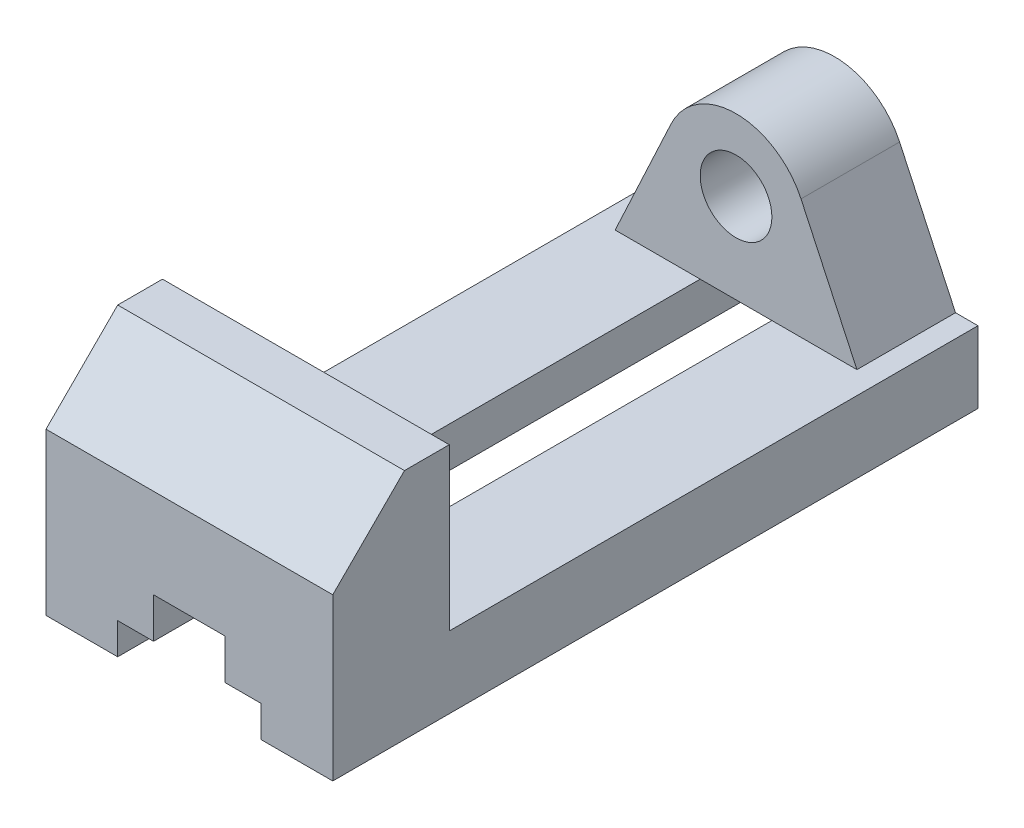
ISO-10303-21;
HEADER;
FILE_DESCRIPTION(('STEP AP214'),'2;1');
FILE_NAME('part.step','',(''),(''),'','','');
FILE_SCHEMA(('AUTOMOTIVE_DESIGN { 1 0 10303 214 1 1 1 1 }'));
ENDSEC;
DATA;
#1=APPLICATION_CONTEXT('core data for automotive mechanical design processes');
#2=APPLICATION_PROTOCOL_DEFINITION('international standard','automotive_design',2000,#1);
#3=PRODUCT_CONTEXT('',#1,'mechanical');
#4=PRODUCT('Part','Part','',(#3));
#5=PRODUCT_RELATED_PRODUCT_CATEGORY('part','',(#4));
#6=PRODUCT_DEFINITION_FORMATION('','',#4);
#7=PRODUCT_DEFINITION_CONTEXT('part definition',#1,'design');
#8=PRODUCT_DEFINITION('design','',#6,#7);
#9=PRODUCT_DEFINITION_SHAPE('','',#8);
#10=(LENGTH_UNIT() NAMED_UNIT(*) SI_UNIT(.MILLI.,.METRE.));
#11=(NAMED_UNIT(*) PLANE_ANGLE_UNIT() SI_UNIT($,.RADIAN.));
#12=(NAMED_UNIT(*) SI_UNIT($,.STERADIAN.) SOLID_ANGLE_UNIT());
#13=UNCERTAINTY_MEASURE_WITH_UNIT(LENGTH_MEASURE(1.E-05),#10,'distance_accuracy_value','');
#14=(GEOMETRIC_REPRESENTATION_CONTEXT(3) GLOBAL_UNCERTAINTY_ASSIGNED_CONTEXT((#13)) GLOBAL_UNIT_ASSIGNED_CONTEXT((#10,
#11,#12)) REPRESENTATION_CONTEXT('',''));
#15=CARTESIAN_POINT('',(0.,0.,0.));
#16=DIRECTION('',(0.,0.,1.));
#17=DIRECTION('',(1.,0.,0.));
#18=AXIS2_PLACEMENT_3D('',#15,#16,#17);
#19=CARTESIAN_POINT('',(0.,-10.,144.));
#20=DIRECTION('',(0.,1.,0.));
#21=DIRECTION('',(-1.,0.,0.));
#22=AXIS2_PLACEMENT_3D('',#19,#20,#21);
#23=PLANE('',#22);
#24=DIRECTION('',(1.,0.,0.));
#25=VECTOR('',#24,1.);
#26=CARTESIAN_POINT('',(0.,-10.,22.));
#27=LINE('',#26,#25);
#28=CARTESIAN_POINT('',(-26.9801998664999,-10.,22.));
#29=VERTEX_POINT('',#28);
#30=CARTESIAN_POINT('',(-8.00000000000001,-10.,22.));
#31=VERTEX_POINT('',#30);
#32=EDGE_CURVE('E257',#29,#31,#27,.T.);
#33=ORIENTED_EDGE('',*,*,#32,.F.);
#34=DIRECTION('',(0.,0.,-1.));
#35=VECTOR('',#34,1.);
#36=CARTESIAN_POINT('',(-26.9801998664999,-10.,22.));
#37=LINE('',#36,#35);
#38=CARTESIAN_POINT('',(-26.9801998664999,-10.,0.));
#39=VERTEX_POINT('',#38);
#40=EDGE_CURVE('E288',#29,#39,#37,.T.);
#41=ORIENTED_EDGE('',*,*,#40,.T.);
#42=DIRECTION('',(1.,0.,0.));
#43=VECTOR('',#42,1.);
#44=CARTESIAN_POINT('',(0.,-10.,0.));
#45=LINE('',#44,#43);
#46=CARTESIAN_POINT('',(-32.,-10.,0.));
#47=VERTEX_POINT('',#46);
#48=EDGE_CURVE('E312',#47,#39,#45,.T.);
#49=ORIENTED_EDGE('',*,*,#48,.F.);
#50=DIRECTION('',(0.,0.,-1.));
#51=VECTOR('',#50,1.);
#52=CARTESIAN_POINT('',(-32.,-10.,144.));
#53=LINE('',#52,#51);
#54=CARTESIAN_POINT('',(-32.,-10.,118.));
#55=VERTEX_POINT('',#54);
#56=EDGE_CURVE('E328',#55,#47,#53,.T.);
#57=ORIENTED_EDGE('',*,*,#56,.F.);
#58=DIRECTION('',(-1.,0.,0.));
#59=VECTOR('',#58,1.);
#60=CARTESIAN_POINT('',(0.,-10.,118.));
#61=LINE('',#60,#59);
#62=CARTESIAN_POINT('',(-8.00000000000001,-10.,118.));
#63=VERTEX_POINT('',#62);
#64=EDGE_CURVE('E456',#63,#55,#61,.T.);
#65=ORIENTED_EDGE('',*,*,#64,.F.);
#66=DIRECTION('',(0.,0.,-1.));
#67=VECTOR('',#66,1.);
#68=CARTESIAN_POINT('',(-8.00000000000001,-10.,144.));
#69=LINE('',#68,#67);
#70=EDGE_CURVE('E331',#63,#31,#69,.T.);
#71=ORIENTED_EDGE('',*,*,#70,.T.);
#72=EDGE_LOOP('',(#33,#41,#49,#57,#65,#71));
#73=FACE_BOUND('',#72,.T.);
#74=ADVANCED_FACE('F47',(#73),#23,.T.);
#75=CARTESIAN_POINT('',(0.,-10.,144.));
#76=DIRECTION('',(0.,1.,0.));
#77=DIRECTION('',(-1.,0.,0.));
#78=AXIS2_PLACEMENT_3D('',#75,#76,#77);
#79=PLANE('',#78);
#80=DIRECTION('',(0.,0.,-1.));
#81=VECTOR('',#80,1.);
#82=CARTESIAN_POINT('',(26.9801998664999,-10.,22.));
#83=LINE('',#82,#81);
#84=CARTESIAN_POINT('',(26.9801998664999,-10.,22.));
#85=VERTEX_POINT('',#84);
#86=CARTESIAN_POINT('',(26.9801998664999,-10.,0.));
#87=VERTEX_POINT('',#86);
#88=EDGE_CURVE('E284',#85,#87,#83,.T.);
#89=ORIENTED_EDGE('',*,*,#88,.F.);
#90=CARTESIAN_POINT('',(7.99999999999999,-10.,22.));
#91=VERTEX_POINT('',#90);
#92=EDGE_CURVE('E256',#91,#85,#27,.T.);
#93=ORIENTED_EDGE('',*,*,#92,.F.);
#94=DIRECTION('',(0.,0.,-1.));
#95=VECTOR('',#94,1.);
#96=CARTESIAN_POINT('',(7.99999999999999,-10.,144.));
#97=LINE('',#96,#95);
#98=CARTESIAN_POINT('',(7.99999999999999,-10.,118.));
#99=VERTEX_POINT('',#98);
#100=EDGE_CURVE('E410',#99,#91,#97,.T.);
#101=ORIENTED_EDGE('',*,*,#100,.F.);
#102=DIRECTION('',(1.,0.,0.));
#103=VECTOR('',#102,1.);
#104=CARTESIAN_POINT('',(0.,-10.,118.));
#105=LINE('',#104,#103);
#106=CARTESIAN_POINT('',(32.,-10.,118.));
#107=VERTEX_POINT('',#106);
#108=EDGE_CURVE('E452',#99,#107,#105,.T.);
#109=ORIENTED_EDGE('',*,*,#108,.T.);
#110=DIRECTION('',(0.,0.,-1.));
#111=VECTOR('',#110,1.);
#112=CARTESIAN_POINT('',(32.,-10.,144.));
#113=LINE('',#112,#111);
#114=CARTESIAN_POINT('',(32.,-10.,0.));
#115=VERTEX_POINT('',#114);
#116=EDGE_CURVE('E436',#107,#115,#113,.T.);
#117=ORIENTED_EDGE('',*,*,#116,.T.);
#118=DIRECTION('',(1.,0.,0.));
#119=VECTOR('',#118,1.);
#120=CARTESIAN_POINT('',(0.,-10.,0.));
#121=LINE('',#120,#119);
#122=EDGE_CURVE('E397',#87,#115,#121,.T.);
#123=ORIENTED_EDGE('',*,*,#122,.F.);
#124=EDGE_LOOP('',(#89,#93,#101,#109,#117,#123));
#125=FACE_BOUND('',#124,.T.);
#126=ADVANCED_FACE('F483',(#125),#79,.T.);
#127=CARTESIAN_POINT('',(7.99999999999999,0.,144.));
#128=DIRECTION('',(-1.,0.,0.));
#129=DIRECTION('',(0.,-1.,0.));
#130=AXIS2_PLACEMENT_3D('',#127,#128,#129);
#131=PLANE('',#130);
#132=CARTESIAN_POINT('',(7.99999999999999,-10.,144.));
#133=VERTEX_POINT('',#132);
#134=EDGE_CURVE('E432',#133,#99,#97,.T.);
#135=ORIENTED_EDGE('',*,*,#134,.T.);
#136=ORIENTED_EDGE('',*,*,#100,.T.);
#137=DIRECTION('',(0.,0.,-1.));
#138=VECTOR('',#137,1.);
#139=CARTESIAN_POINT('',(7.99999999999999,-10.,144.));
#140=LINE('',#139,#138);
#141=CARTESIAN_POINT('',(7.99999999999999,-10.,0.));
#142=VERTEX_POINT('',#141);
#143=EDGE_CURVE('E300',#91,#142,#140,.T.);
#144=ORIENTED_EDGE('',*,*,#143,.T.);
#145=DIRECTION('',(0.,1.,0.));
#146=VECTOR('',#145,1.);
#147=CARTESIAN_POINT('',(7.99999999999999,0.,0.));
#148=LINE('',#147,#146);
#149=CARTESIAN_POINT('',(7.99999999999999,-19.,0.));
#150=VERTEX_POINT('',#149);
#151=EDGE_CURVE('E391',#150,#142,#148,.T.);
#152=ORIENTED_EDGE('',*,*,#151,.F.);
#153=DIRECTION('',(0.,0.,-1.));
#154=VECTOR('',#153,1.);
#155=CARTESIAN_POINT('',(7.99999999999999,-19.,144.));
#156=LINE('',#155,#154);
#157=CARTESIAN_POINT('',(7.99999999999999,-19.,144.));
#158=VERTEX_POINT('',#157);
#159=EDGE_CURVE('E449',#158,#150,#156,.T.);
#160=ORIENTED_EDGE('',*,*,#159,.F.);
#161=DIRECTION('',(0.,1.,0.));
#162=VECTOR('',#161,1.);
#163=CARTESIAN_POINT('',(7.99999999999999,0.,144.));
#164=LINE('',#163,#162);
#165=EDGE_CURVE('E392',#158,#133,#164,.T.);
#166=ORIENTED_EDGE('',*,*,#165,.T.);
#167=EDGE_LOOP('',(#135,#136,#144,#152,#160,#166));
#168=FACE_BOUND('',#167,.T.);
#169=ADVANCED_FACE('F530',(#168),#131,.T.);
#170=CARTESIAN_POINT('',(0.,-19.,144.));
#171=DIRECTION('',(0.,1.,0.));
#172=DIRECTION('',(0.,0.,1.));
#173=AXIS2_PLACEMENT_3D('',#170,#171,#172);
#174=PLANE('',#173);
#175=ORIENTED_EDGE('',*,*,#159,.T.);
#176=DIRECTION('',(1.,0.,0.));
#177=VECTOR('',#176,1.);
#178=CARTESIAN_POINT('',(0.,-19.,0.));
#179=LINE('',#178,#177);
#180=CARTESIAN_POINT('',(16.,-19.,0.));
#181=VERTEX_POINT('',#180);
#182=EDGE_CURVE('E414',#150,#181,#179,.T.);
#183=ORIENTED_EDGE('',*,*,#182,.T.);
#184=DIRECTION('',(0.,0.,-1.));
#185=VECTOR('',#184,1.);
#186=CARTESIAN_POINT('',(16.,-19.,144.));
#187=LINE('',#186,#185);
#188=CARTESIAN_POINT('',(16.,-19.,144.));
#189=VERTEX_POINT('',#188);
#190=EDGE_CURVE('E446',#189,#181,#187,.T.);
#191=ORIENTED_EDGE('',*,*,#190,.F.);
#192=DIRECTION('',(1.,0.,0.));
#193=VECTOR('',#192,1.);
#194=CARTESIAN_POINT('',(0.,-19.,144.));
#195=LINE('',#194,#193);
#196=EDGE_CURVE('E396',#158,#189,#195,.T.);
#197=ORIENTED_EDGE('',*,*,#196,.F.);
#198=EDGE_LOOP('',(#175,#183,#191,#197));
#199=FACE_BOUND('',#198,.T.);
#200=ADVANCED_FACE('F527',(#199),#174,.F.);
#201=CARTESIAN_POINT('',(16.,0.,144.));
#202=DIRECTION('',(-1.,0.,0.));
#203=DIRECTION('',(0.,-1.,0.));
#204=AXIS2_PLACEMENT_3D('',#201,#202,#203);
#205=PLANE('',#204);
#206=ORIENTED_EDGE('',*,*,#190,.T.);
#207=DIRECTION('',(0.,1.,0.));
#208=VECTOR('',#207,1.);
#209=CARTESIAN_POINT('',(16.,0.,0.));
#210=LINE('',#209,#208);
#211=CARTESIAN_POINT('',(16.,-26.,0.));
#212=VERTEX_POINT('',#211);
#213=EDGE_CURVE('E418',#212,#181,#210,.T.);
#214=ORIENTED_EDGE('',*,*,#213,.F.);
#215=DIRECTION('',(0.,0.,-1.));
#216=VECTOR('',#215,1.);
#217=CARTESIAN_POINT('',(16.,-26.,144.));
#218=LINE('',#217,#216);
#219=CARTESIAN_POINT('',(16.,-26.,144.));
#220=VERTEX_POINT('',#219);
#221=EDGE_CURVE('E443',#220,#212,#218,.T.);
#222=ORIENTED_EDGE('',*,*,#221,.F.);
#223=DIRECTION('',(0.,1.,0.));
#224=VECTOR('',#223,1.);
#225=CARTESIAN_POINT('',(16.,0.,144.));
#226=LINE('',#225,#224);
#227=EDGE_CURVE('E400',#220,#189,#226,.T.);
#228=ORIENTED_EDGE('',*,*,#227,.T.);
#229=EDGE_LOOP('',(#206,#214,#222,#228));
#230=FACE_BOUND('',#229,.T.);
#231=ADVANCED_FACE('F522',(#230),#205,.T.);
#232=CARTESIAN_POINT('',(0.,-26.,144.));
#233=DIRECTION('',(0.,1.,0.));
#234=DIRECTION('',(-1.,0.,0.));
#235=AXIS2_PLACEMENT_3D('',#232,#233,#234);
#236=PLANE('',#235);
#237=CARTESIAN_POINT('',(22.,-26.,38.));
#238=DIRECTION('',(0.,-1.,0.));
#239=DIRECTION('',(0.,0.,-1.));
#240=AXIS2_PLACEMENT_3D('',#237,#238,#239);
#241=CIRCLE('',#240,2.99999999999999);
#242=CARTESIAN_POINT('',(22.,-26.,35.));
#243=VERTEX_POINT('',#242);
#244=EDGE_CURVE('E214',#243,#243,#241,.T.);
#245=ORIENTED_EDGE('',*,*,#244,.F.);
#246=EDGE_LOOP('',(#245));
#247=FACE_BOUND('',#246,.T.);
#248=CARTESIAN_POINT('',(22.,-26.,108.));
#249=DIRECTION('',(0.,-1.,0.));
#250=DIRECTION('',(0.,0.,-1.));
#251=AXIS2_PLACEMENT_3D('',#248,#249,#250);
#252=CIRCLE('',#251,2.99999999999999);
#253=CARTESIAN_POINT('',(22.,-26.,105.));
#254=VERTEX_POINT('',#253);
#255=EDGE_CURVE('E227',#254,#254,#252,.T.);
#256=ORIENTED_EDGE('',*,*,#255,.F.);
#257=EDGE_LOOP('',(#256));
#258=FACE_BOUND('',#257,.T.);
#259=ORIENTED_EDGE('',*,*,#221,.T.);
#260=DIRECTION('',(1.,0.,0.));
#261=VECTOR('',#260,1.);
#262=CARTESIAN_POINT('',(0.,-26.,0.));
#263=LINE('',#262,#261);
#264=CARTESIAN_POINT('',(32.,-26.,0.));
#265=VERTEX_POINT('',#264);
#266=EDGE_CURVE('E422',#212,#265,#263,.T.);
#267=ORIENTED_EDGE('',*,*,#266,.T.);
#268=DIRECTION('',(0.,0.,-1.));
#269=VECTOR('',#268,1.);
#270=CARTESIAN_POINT('',(32.,-26.,144.));
#271=LINE('',#270,#269);
#272=CARTESIAN_POINT('',(32.,-26.,144.));
#273=VERTEX_POINT('',#272);
#274=EDGE_CURVE('E440',#273,#265,#271,.T.);
#275=ORIENTED_EDGE('',*,*,#274,.F.);
#276=DIRECTION('',(1.,0.,0.));
#277=VECTOR('',#276,1.);
#278=CARTESIAN_POINT('',(0.,-26.,144.));
#279=LINE('',#278,#277);
#280=EDGE_CURVE('E404',#220,#273,#279,.T.);
#281=ORIENTED_EDGE('',*,*,#280,.F.);
#282=EDGE_LOOP('',(#259,#267,#275,#281));
#283=FACE_BOUND('',#282,.T.);
#284=ADVANCED_FACE('F518',(#247,#258,#283),#236,.F.);
#285=CARTESIAN_POINT('',(32.,0.,144.));
#286=DIRECTION('',(-1.,0.,0.));
#287=DIRECTION('',(0.,-1.,0.));
#288=AXIS2_PLACEMENT_3D('',#285,#286,#287);
#289=PLANE('',#288);
#290=DIRECTION('',(0.,0.,-1.));
#291=VECTOR('',#290,1.);
#292=CARTESIAN_POINT('',(32.,26.,144.));
#293=LINE('',#292,#291);
#294=CARTESIAN_POINT('',(32.,26.,128.));
#295=VERTEX_POINT('',#294);
#296=CARTESIAN_POINT('',(32.,26.,118.));
#297=VERTEX_POINT('',#296);
#298=EDGE_CURVE('E355',#295,#297,#293,.T.);
#299=ORIENTED_EDGE('',*,*,#298,.F.);
#300=DIRECTION('',(0.,0.707106781186548,-0.707106781186547));
#301=VECTOR('',#300,1.);
#302=CARTESIAN_POINT('',(32.,26.,128.));
#303=LINE('',#302,#301);
#304=CARTESIAN_POINT('',(32.,10.,144.));
#305=VERTEX_POINT('',#304);
#306=EDGE_CURVE('E71',#295,#305,#303,.F.);
#307=ORIENTED_EDGE('',*,*,#306,.T.);
#308=DIRECTION('',(0.,1.,0.));
#309=VECTOR('',#308,1.);
#310=CARTESIAN_POINT('',(32.,0.,144.));
#311=LINE('',#310,#309);
#312=EDGE_CURVE('E407',#273,#305,#311,.T.);
#313=ORIENTED_EDGE('',*,*,#312,.F.);
#314=ORIENTED_EDGE('',*,*,#274,.T.);
#315=DIRECTION('',(0.,1.,0.));
#316=VECTOR('',#315,1.);
#317=CARTESIAN_POINT('',(32.,0.,0.));
#318=LINE('',#317,#316);
#319=EDGE_CURVE('E426',#265,#115,#318,.T.);
#320=ORIENTED_EDGE('',*,*,#319,.T.);
#321=ORIENTED_EDGE('',*,*,#116,.F.);
#322=DIRECTION('',(0.,1.,0.));
#323=VECTOR('',#322,1.);
#324=CARTESIAN_POINT('',(32.,0.,118.));
#325=LINE('',#324,#323);
#326=EDGE_CURVE('E340',#107,#297,#325,.T.);
#327=ORIENTED_EDGE('',*,*,#326,.T.);
#328=EDGE_LOOP('',(#299,#307,#313,#314,#320,#321,#327));
#329=FACE_BOUND('',#328,.T.);
#330=ADVANCED_FACE('F514',(#329),#289,.F.);
#331=CARTESIAN_POINT('',(0.,0.,144.));
#332=DIRECTION('',(0.,0.,1.));
#333=DIRECTION('',(1.,0.,0.));
#334=AXIS2_PLACEMENT_3D('',#331,#332,#333);
#335=PLANE('',#334);
#336=ORIENTED_EDGE('',*,*,#312,.T.);
#337=DIRECTION('',(-1.,0.,0.));
#338=VECTOR('',#337,1.);
#339=CARTESIAN_POINT('',(0.,10.,144.));
#340=LINE('',#339,#338);
#341=CARTESIAN_POINT('',(-32.,10.,144.));
#342=VERTEX_POINT('',#341);
#343=EDGE_CURVE('E57',#305,#342,#340,.T.);
#344=ORIENTED_EDGE('',*,*,#343,.T.);
#345=DIRECTION('',(0.,1.,0.));
#346=VECTOR('',#345,1.);
#347=CARTESIAN_POINT('',(-32.,0.,144.));
#348=LINE('',#347,#346);
#349=CARTESIAN_POINT('',(-32.,-26.,144.));
#350=VERTEX_POINT('',#349);
#351=EDGE_CURVE('E336',#350,#342,#348,.T.);
#352=ORIENTED_EDGE('',*,*,#351,.F.);
#353=DIRECTION('',(1.,0.,0.));
#354=VECTOR('',#353,1.);
#355=CARTESIAN_POINT('',(0.,-26.,144.));
#356=LINE('',#355,#354);
#357=CARTESIAN_POINT('',(-16.,-26.,144.));
#358=VERTEX_POINT('',#357);
#359=EDGE_CURVE('E339',#350,#358,#356,.T.);
#360=ORIENTED_EDGE('',*,*,#359,.T.);
#361=DIRECTION('',(0.,1.,0.));
#362=VECTOR('',#361,1.);
#363=CARTESIAN_POINT('',(-16.,0.,144.));
#364=LINE('',#363,#362);
#365=CARTESIAN_POINT('',(-16.,-19.,144.));
#366=VERTEX_POINT('',#365);
#367=EDGE_CURVE('E343',#358,#366,#364,.T.);
#368=ORIENTED_EDGE('',*,*,#367,.T.);
#369=DIRECTION('',(1.,0.,0.));
#370=VECTOR('',#369,1.);
#371=CARTESIAN_POINT('',(0.,-19.,144.));
#372=LINE('',#371,#370);
#373=CARTESIAN_POINT('',(-8.00000000000001,-19.,144.));
#374=VERTEX_POINT('',#373);
#375=EDGE_CURVE('E346',#366,#374,#372,.T.);
#376=ORIENTED_EDGE('',*,*,#375,.T.);
#377=DIRECTION('',(0.,1.,0.));
#378=VECTOR('',#377,1.);
#379=CARTESIAN_POINT('',(-8.00000000000001,0.,144.));
#380=LINE('',#379,#378);
#381=CARTESIAN_POINT('',(-8.00000000000001,-10.,144.));
#382=VERTEX_POINT('',#381);
#383=EDGE_CURVE('E349',#374,#382,#380,.T.);
#384=ORIENTED_EDGE('',*,*,#383,.T.);
#385=DIRECTION('',(1.,0.,0.));
#386=VECTOR('',#385,1.);
#387=CARTESIAN_POINT('',(0.,-10.,144.));
#388=LINE('',#387,#386);
#389=EDGE_CURVE('E352',#382,#133,#388,.T.);
#390=ORIENTED_EDGE('',*,*,#389,.T.);
#391=ORIENTED_EDGE('',*,*,#165,.F.);
#392=ORIENTED_EDGE('',*,*,#196,.T.);
#393=ORIENTED_EDGE('',*,*,#227,.F.);
#394=ORIENTED_EDGE('',*,*,#280,.T.);
#395=EDGE_LOOP('',(#336,#344,#352,#360,#368,#376,#384,#390,#391,#392,#393,#394));
#396=FACE_BOUND('',#395,.T.);
#397=ADVANCED_FACE('F558',(#396),#335,.T.);
#398=CARTESIAN_POINT('',(0.,0.,0.));
#399=DIRECTION('',(0.,0.,1.));
#400=DIRECTION('',(1.,0.,0.));
#401=AXIS2_PLACEMENT_3D('',#398,#399,#400);
#402=PLANE('',#401);
#403=ORIENTED_EDGE('',*,*,#151,.T.);
#404=DIRECTION('',(1.,0.,0.));
#405=VECTOR('',#404,1.);
#406=CARTESIAN_POINT('',(0.,-10.,0.));
#407=LINE('',#406,#405);
#408=CARTESIAN_POINT('',(-8.00000000000001,-10.,0.));
#409=VERTEX_POINT('',#408);
#410=EDGE_CURVE('E277',#409,#142,#407,.T.);
#411=ORIENTED_EDGE('',*,*,#410,.F.);
#412=DIRECTION('',(0.,1.,0.));
#413=VECTOR('',#412,1.);
#414=CARTESIAN_POINT('',(-8.00000000000001,0.,0.));
#415=LINE('',#414,#413);
#416=CARTESIAN_POINT('',(-8.00000000000001,-19.,0.));
#417=VERTEX_POINT('',#416);
#418=EDGE_CURVE('E308',#417,#409,#415,.T.);
#419=ORIENTED_EDGE('',*,*,#418,.F.);
#420=DIRECTION('',(1.,0.,0.));
#421=VECTOR('',#420,1.);
#422=CARTESIAN_POINT('',(0.,-19.,0.));
#423=LINE('',#422,#421);
#424=CARTESIAN_POINT('',(-16.,-19.,0.));
#425=VERTEX_POINT('',#424);
#426=EDGE_CURVE('E304',#425,#417,#423,.T.);
#427=ORIENTED_EDGE('',*,*,#426,.F.);
#428=DIRECTION('',(0.,1.,0.));
#429=VECTOR('',#428,1.);
#430=CARTESIAN_POINT('',(-16.,0.,0.));
#431=LINE('',#430,#429);
#432=CARTESIAN_POINT('',(-16.,-26.,0.));
#433=VERTEX_POINT('',#432);
#434=EDGE_CURVE('E324',#433,#425,#431,.T.);
#435=ORIENTED_EDGE('',*,*,#434,.F.);
#436=DIRECTION('',(1.,0.,0.));
#437=VECTOR('',#436,1.);
#438=CARTESIAN_POINT('',(0.,-26.,0.));
#439=LINE('',#438,#437);
#440=CARTESIAN_POINT('',(-32.,-26.,0.));
#441=VERTEX_POINT('',#440);
#442=EDGE_CURVE('E320',#441,#433,#439,.T.);
#443=ORIENTED_EDGE('',*,*,#442,.F.);
#444=DIRECTION('',(0.,1.,0.));
#445=VECTOR('',#444,1.);
#446=CARTESIAN_POINT('',(-32.,0.,0.));
#447=LINE('',#446,#445);
#448=EDGE_CURVE('E316',#441,#47,#447,.T.);
#449=ORIENTED_EDGE('',*,*,#448,.T.);
#450=ORIENTED_EDGE('',*,*,#48,.T.);
#451=DIRECTION('',(-0.4226182617407,-0.90630778703665,0.));
#452=VECTOR('',#451,1.);
#453=CARTESIAN_POINT('',(-18.3311468081813,8.54795413941851,0.));
#454=LINE('',#453,#452);
#455=CARTESIAN_POINT('',(-14.5009245925864,16.7618921878512,0.));
#456=VERTEX_POINT('',#455);
#457=EDGE_CURVE('E274',#456,#39,#454,.T.);
#458=ORIENTED_EDGE('',*,*,#457,.F.);
#459=CARTESIAN_POINT('',(0.,9.99999999999999,0.));
#460=DIRECTION('',(0.,0.,1.));
#461=DIRECTION('',(1.,0.,0.));
#462=AXIS2_PLACEMENT_3D('',#459,#460,#461);
#463=CIRCLE('',#462,16.);
#464=CARTESIAN_POINT('',(14.5009245925864,16.7618921878512,0.));
#465=VERTEX_POINT('',#464);
#466=EDGE_CURVE('E270',#465,#456,#463,.T.);
#467=ORIENTED_EDGE('',*,*,#466,.F.);
#468=DIRECTION('',(0.4226182617407,-0.90630778703665,0.));
#469=VECTOR('',#468,1.);
#470=CARTESIAN_POINT('',(18.3311468081813,8.54795413941852,0.));
#471=LINE('',#470,#469);
#472=EDGE_CURVE('E249',#465,#87,#471,.T.);
#473=ORIENTED_EDGE('',*,*,#472,.T.);
#474=ORIENTED_EDGE('',*,*,#122,.T.);
#475=ORIENTED_EDGE('',*,*,#319,.F.);
#476=ORIENTED_EDGE('',*,*,#266,.F.);
#477=ORIENTED_EDGE('',*,*,#213,.T.);
#478=ORIENTED_EDGE('',*,*,#182,.F.);
#479=EDGE_LOOP('',(#403,#411,#419,#427,#435,#443,#449,#450,#458,#467,#473,#474,#475,#476,#477,#478));
#480=FACE_BOUND('',#479,.T.);
#481=CARTESIAN_POINT('',(0.,9.99999999999999,0.));
#482=DIRECTION('',(0.,0.,1.));
#483=DIRECTION('',(1.,0.,0.));
#484=AXIS2_PLACEMENT_3D('',#481,#482,#483);
#485=CIRCLE('',#484,8.);
#486=CARTESIAN_POINT('',(7.99999999999999,9.99999999999999,0.));
#487=VERTEX_POINT('',#486);
#488=EDGE_CURVE('E243',#487,#487,#485,.T.);
#489=ORIENTED_EDGE('',*,*,#488,.T.);
#490=EDGE_LOOP('',(#489));
#491=FACE_BOUND('',#490,.T.);
#492=ADVANCED_FACE('F487',(#480,#491),#402,.F.);
#493=CARTESIAN_POINT('',(0.,26.,144.));
#494=DIRECTION('',(0.,1.,0.));
#495=DIRECTION('',(0.,0.,1.));
#496=AXIS2_PLACEMENT_3D('',#493,#494,#495);
#497=PLANE('',#496);
#498=DIRECTION('',(0.,0.,-1.));
#499=VECTOR('',#498,1.);
#500=CARTESIAN_POINT('',(-32.,26.,144.));
#501=LINE('',#500,#499);
#502=CARTESIAN_POINT('',(-32.,26.,128.));
#503=VERTEX_POINT('',#502);
#504=CARTESIAN_POINT('',(-32.,26.,118.));
#505=VERTEX_POINT('',#504);
#506=EDGE_CURVE('E388',#503,#505,#501,.T.);
#507=ORIENTED_EDGE('',*,*,#506,.F.);
#508=DIRECTION('',(1.,0.,0.));
#509=VECTOR('',#508,1.);
#510=CARTESIAN_POINT('',(0.,26.,128.));
#511=LINE('',#510,#509);
#512=EDGE_CURVE('E460',#503,#295,#511,.T.);
#513=ORIENTED_EDGE('',*,*,#512,.T.);
#514=ORIENTED_EDGE('',*,*,#298,.T.);
#515=DIRECTION('',(1.,0.,0.));
#516=VECTOR('',#515,1.);
#517=CARTESIAN_POINT('',(0.,26.,118.));
#518=LINE('',#517,#516);
#519=EDGE_CURVE('E335',#505,#297,#518,.T.);
#520=ORIENTED_EDGE('',*,*,#519,.F.);
#521=EDGE_LOOP('',(#507,#513,#514,#520));
#522=FACE_BOUND('',#521,.T.);
#523=ADVANCED_FACE('F554',(#522),#497,.T.);
#524=CARTESIAN_POINT('',(-32.,0.,144.));
#525=DIRECTION('',(-1.,0.,0.));
#526=DIRECTION('',(0.,-1.,0.));
#527=AXIS2_PLACEMENT_3D('',#524,#525,#526);
#528=PLANE('',#527);
#529=ORIENTED_EDGE('',*,*,#351,.T.);
#530=DIRECTION('',(0.,-0.707106781186548,0.707106781186547));
#531=VECTOR('',#530,1.);
#532=CARTESIAN_POINT('',(-32.,5.,149.));
#533=LINE('',#532,#531);
#534=EDGE_CURVE('E11',#342,#503,#533,.F.);
#535=ORIENTED_EDGE('',*,*,#534,.T.);
#536=ORIENTED_EDGE('',*,*,#506,.T.);
#537=DIRECTION('',(0.,1.,0.));
#538=VECTOR('',#537,1.);
#539=CARTESIAN_POINT('',(-32.,0.,118.));
#540=LINE('',#539,#538);
#541=EDGE_CURVE('E359',#55,#505,#540,.T.);
#542=ORIENTED_EDGE('',*,*,#541,.F.);
#543=ORIENTED_EDGE('',*,*,#56,.T.);
#544=ORIENTED_EDGE('',*,*,#448,.F.);
#545=DIRECTION('',(0.,0.,-1.));
#546=VECTOR('',#545,1.);
#547=CARTESIAN_POINT('',(-32.,-26.,144.));
#548=LINE('',#547,#546);
#549=EDGE_CURVE('E385',#350,#441,#548,.T.);
#550=ORIENTED_EDGE('',*,*,#549,.F.);
#551=EDGE_LOOP('',(#529,#535,#536,#542,#543,#544,#550));
#552=FACE_BOUND('',#551,.T.);
#553=ADVANCED_FACE('F549',(#552),#528,.T.);
#554=CARTESIAN_POINT('',(0.,-26.,144.));
#555=DIRECTION('',(0.,1.,0.));
#556=DIRECTION('',(-1.,0.,0.));
#557=AXIS2_PLACEMENT_3D('',#554,#555,#556);
#558=PLANE('',#557);
#559=CARTESIAN_POINT('',(-22.,-26.,108.));
#560=DIRECTION('',(0.,-1.,0.));
#561=DIRECTION('',(0.,0.,-1.));
#562=AXIS2_PLACEMENT_3D('',#559,#560,#561);
#563=CIRCLE('',#562,2.99999999999999);
#564=CARTESIAN_POINT('',(-22.,-26.,105.));
#565=VERTEX_POINT('',#564);
#566=EDGE_CURVE('E213',#565,#565,#563,.T.);
#567=ORIENTED_EDGE('',*,*,#566,.F.);
#568=EDGE_LOOP('',(#567));
#569=FACE_BOUND('',#568,.T.);
#570=CARTESIAN_POINT('',(-22.,-26.,38.));
#571=DIRECTION('',(0.,-1.,0.));
#572=DIRECTION('',(0.,0.,-1.));
#573=AXIS2_PLACEMENT_3D('',#570,#571,#572);
#574=CIRCLE('',#573,2.99999999999999);
#575=CARTESIAN_POINT('',(-22.,-26.,35.));
#576=VERTEX_POINT('',#575);
#577=EDGE_CURVE('E235',#576,#576,#574,.T.);
#578=ORIENTED_EDGE('',*,*,#577,.F.);
#579=EDGE_LOOP('',(#578));
#580=FACE_BOUND('',#579,.T.);
#581=ORIENTED_EDGE('',*,*,#549,.T.);
#582=ORIENTED_EDGE('',*,*,#442,.T.);
#583=DIRECTION('',(0.,0.,-1.));
#584=VECTOR('',#583,1.);
#585=CARTESIAN_POINT('',(-16.,-26.,144.));
#586=LINE('',#585,#584);
#587=EDGE_CURVE('E382',#358,#433,#586,.T.);
#588=ORIENTED_EDGE('',*,*,#587,.F.);
#589=ORIENTED_EDGE('',*,*,#359,.F.);
#590=EDGE_LOOP('',(#581,#582,#588,#589));
#591=FACE_BOUND('',#590,.T.);
#592=ADVANCED_FACE('F559',(#569,#580,#591),#558,.F.);
#593=CARTESIAN_POINT('',(-16.,0.,144.));
#594=DIRECTION('',(-1.,0.,0.));
#595=DIRECTION('',(0.,-1.,0.));
#596=AXIS2_PLACEMENT_3D('',#593,#594,#595);
#597=PLANE('',#596);
#598=ORIENTED_EDGE('',*,*,#587,.T.);
#599=ORIENTED_EDGE('',*,*,#434,.T.);
#600=DIRECTION('',(0.,0.,-1.));
#601=VECTOR('',#600,1.);
#602=CARTESIAN_POINT('',(-16.,-19.,144.));
#603=LINE('',#602,#601);
#604=EDGE_CURVE('E379',#366,#425,#603,.T.);
#605=ORIENTED_EDGE('',*,*,#604,.F.);
#606=ORIENTED_EDGE('',*,*,#367,.F.);
#607=EDGE_LOOP('',(#598,#599,#605,#606));
#608=FACE_BOUND('',#607,.T.);
#609=ADVANCED_FACE('F543',(#608),#597,.F.);
#610=CARTESIAN_POINT('',(0.,-19.,144.));
#611=DIRECTION('',(0.,1.,0.));
#612=DIRECTION('',(0.,0.,1.));
#613=AXIS2_PLACEMENT_3D('',#610,#611,#612);
#614=PLANE('',#613);
#615=ORIENTED_EDGE('',*,*,#604,.T.);
#616=ORIENTED_EDGE('',*,*,#426,.T.);
#617=DIRECTION('',(0.,0.,-1.));
#618=VECTOR('',#617,1.);
#619=CARTESIAN_POINT('',(-8.00000000000001,-19.,144.));
#620=LINE('',#619,#618);
#621=EDGE_CURVE('E376',#374,#417,#620,.T.);
#622=ORIENTED_EDGE('',*,*,#621,.F.);
#623=ORIENTED_EDGE('',*,*,#375,.F.);
#624=EDGE_LOOP('',(#615,#616,#622,#623));
#625=FACE_BOUND('',#624,.T.);
#626=ADVANCED_FACE('F538',(#625),#614,.F.);
#627=CARTESIAN_POINT('',(-8.00000000000001,0.,144.));
#628=DIRECTION('',(-1.,0.,0.));
#629=DIRECTION('',(0.,-1.,0.));
#630=AXIS2_PLACEMENT_3D('',#627,#628,#629);
#631=PLANE('',#630);
#632=ORIENTED_EDGE('',*,*,#621,.T.);
#633=ORIENTED_EDGE('',*,*,#418,.T.);
#634=DIRECTION('',(0.,0.,-1.));
#635=VECTOR('',#634,1.);
#636=CARTESIAN_POINT('',(-8.00000000000001,-10.,144.));
#637=LINE('',#636,#635);
#638=EDGE_CURVE('E296',#31,#409,#637,.T.);
#639=ORIENTED_EDGE('',*,*,#638,.F.);
#640=ORIENTED_EDGE('',*,*,#70,.F.);
#641=DIRECTION('',(0.,0.,-1.));
#642=VECTOR('',#641,1.);
#643=CARTESIAN_POINT('',(-8.00000000000001,-10.,144.));
#644=LINE('',#643,#642);
#645=EDGE_CURVE('E372',#382,#63,#644,.T.);
#646=ORIENTED_EDGE('',*,*,#645,.F.);
#647=ORIENTED_EDGE('',*,*,#383,.F.);
#648=EDGE_LOOP('',(#632,#633,#639,#640,#646,#647));
#649=FACE_BOUND('',#648,.T.);
#650=ADVANCED_FACE('F504',(#649),#631,.F.);
#651=CARTESIAN_POINT('',(0.,-10.,144.));
#652=DIRECTION('',(0.,1.,0.));
#653=DIRECTION('',(-1.,0.,0.));
#654=AXIS2_PLACEMENT_3D('',#651,#652,#653);
#655=PLANE('',#654);
#656=DIRECTION('',(1.,0.,0.));
#657=VECTOR('',#656,1.);
#658=CARTESIAN_POINT('',(0.,-10.,118.));
#659=LINE('',#658,#657);
#660=EDGE_CURVE('E363',#63,#99,#659,.T.);
#661=ORIENTED_EDGE('',*,*,#660,.T.);
#662=ORIENTED_EDGE('',*,*,#134,.F.);
#663=ORIENTED_EDGE('',*,*,#389,.F.);
#664=ORIENTED_EDGE('',*,*,#645,.T.);
#665=EDGE_LOOP('',(#661,#662,#663,#664));
#666=FACE_BOUND('',#665,.T.);
#667=ADVANCED_FACE('F509',(#666),#655,.F.);
#668=CARTESIAN_POINT('',(0.,0.,118.));
#669=DIRECTION('',(0.,0.,1.));
#670=DIRECTION('',(1.,0.,0.));
#671=AXIS2_PLACEMENT_3D('',#668,#669,#670);
#672=PLANE('',#671);
#673=ORIENTED_EDGE('',*,*,#660,.F.);
#674=ORIENTED_EDGE('',*,*,#64,.T.);
#675=ORIENTED_EDGE('',*,*,#541,.T.);
#676=ORIENTED_EDGE('',*,*,#519,.T.);
#677=ORIENTED_EDGE('',*,*,#326,.F.);
#678=ORIENTED_EDGE('',*,*,#108,.F.);
#679=EDGE_LOOP('',(#673,#674,#675,#676,#677,#678));
#680=FACE_BOUND('',#679,.T.);
#681=ADVANCED_FACE('F512',(#680),#672,.F.);
#682=CARTESIAN_POINT('',(0.,-10.,22.));
#683=DIRECTION('',(0.,1.,0.));
#684=DIRECTION('',(-1.,0.,0.));
#685=AXIS2_PLACEMENT_3D('',#682,#683,#684);
#686=PLANE('',#685);
#687=ORIENTED_EDGE('',*,*,#143,.F.);
#688=EDGE_CURVE('E262',#31,#91,#27,.T.);
#689=ORIENTED_EDGE('',*,*,#688,.F.);
#690=ORIENTED_EDGE('',*,*,#638,.T.);
#691=ORIENTED_EDGE('',*,*,#410,.T.);
#692=EDGE_LOOP('',(#687,#689,#690,#691));
#693=FACE_BOUND('',#692,.T.);
#694=ADVANCED_FACE('F532',(#693),#686,.F.);
#695=CARTESIAN_POINT('',(0.,9.99999999999999,22.));
#696=DIRECTION('',(0.,0.,-1.));
#697=DIRECTION('',(-1.,0.,0.));
#698=AXIS2_PLACEMENT_3D('',#695,#696,#697);
#699=CYLINDRICAL_SURFACE('',#698,16.);
#700=ORIENTED_EDGE('',*,*,#466,.T.);
#701=DIRECTION('',(0.,0.,-1.));
#702=VECTOR('',#701,1.);
#703=CARTESIAN_POINT('',(-14.5009245925864,16.7618921878512,22.));
#704=LINE('',#703,#702);
#705=CARTESIAN_POINT('',(-14.5009245925864,16.7618921878512,22.));
#706=VERTEX_POINT('',#705);
#707=EDGE_CURVE('E292',#706,#456,#704,.T.);
#708=ORIENTED_EDGE('',*,*,#707,.F.);
#709=CARTESIAN_POINT('',(0.,9.99999999999999,22.));
#710=DIRECTION('',(0.,0.,1.));
#711=DIRECTION('',(1.,0.,0.));
#712=AXIS2_PLACEMENT_3D('',#709,#710,#711);
#713=CIRCLE('',#712,16.);
#714=CARTESIAN_POINT('',(14.5009245925864,16.7618921878512,22.));
#715=VERTEX_POINT('',#714);
#716=EDGE_CURVE('E248',#715,#706,#713,.T.);
#717=ORIENTED_EDGE('',*,*,#716,.F.);
#718=DIRECTION('',(0.,0.,-1.));
#719=VECTOR('',#718,1.);
#720=CARTESIAN_POINT('',(14.5009245925864,16.7618921878512,22.));
#721=LINE('',#720,#719);
#722=EDGE_CURVE('E266',#715,#465,#721,.T.);
#723=ORIENTED_EDGE('',*,*,#722,.T.);
#724=EDGE_LOOP('',(#700,#708,#717,#723));
#725=FACE_BOUND('',#724,.T.);
#726=ADVANCED_FACE('F493',(#725),#699,.T.);
#727=CARTESIAN_POINT('',(-18.3311468081813,8.54795413941851,22.));
#728=DIRECTION('',(0.90630778703665,-0.4226182617407,0.));
#729=DIRECTION('',(0.4226182617407,0.90630778703665,0.));
#730=AXIS2_PLACEMENT_3D('',#727,#728,#729);
#731=PLANE('',#730);
#732=ORIENTED_EDGE('',*,*,#457,.T.);
#733=ORIENTED_EDGE('',*,*,#40,.F.);
#734=DIRECTION('',(-0.4226182617407,-0.90630778703665,0.));
#735=VECTOR('',#734,1.);
#736=CARTESIAN_POINT('',(-18.3311468081813,8.54795413941851,22.));
#737=LINE('',#736,#735);
#738=EDGE_CURVE('E253',#706,#29,#737,.T.);
#739=ORIENTED_EDGE('',*,*,#738,.F.);
#740=ORIENTED_EDGE('',*,*,#707,.T.);
#741=EDGE_LOOP('',(#732,#733,#739,#740));
#742=FACE_BOUND('',#741,.T.);
#743=ADVANCED_FACE('F498',(#742),#731,.F.);
#744=CARTESIAN_POINT('',(0.,9.99999999999999,22.));
#745=DIRECTION('',(0.,0.,-1.));
#746=DIRECTION('',(-1.,0.,0.));
#747=AXIS2_PLACEMENT_3D('',#744,#745,#746);
#748=CYLINDRICAL_SURFACE('',#747,8.);
#749=CARTESIAN_POINT('',(0.,9.99999999999999,22.));
#750=DIRECTION('',(0.,0.,1.));
#751=DIRECTION('',(1.,0.,0.));
#752=AXIS2_PLACEMENT_3D('',#749,#750,#751);
#753=CIRCLE('',#752,8.);
#754=CARTESIAN_POINT('',(7.99999999999999,9.99999999999999,22.));
#755=VERTEX_POINT('',#754);
#756=EDGE_CURVE('E244',#755,#755,#753,.T.);
#757=ORIENTED_EDGE('',*,*,#756,.T.);
#758=EDGE_LOOP('',(#757));
#759=FACE_BOUND('',#758,.T.);
#760=ORIENTED_EDGE('',*,*,#488,.F.);
#761=EDGE_LOOP('',(#760));
#762=FACE_BOUND('',#761,.T.);
#763=ADVANCED_FACE('F582',(#759,#762),#748,.F.);
#764=CARTESIAN_POINT('',(18.3311468081813,8.54795413941852,22.));
#765=DIRECTION('',(0.90630778703665,0.4226182617407,0.));
#766=DIRECTION('',(-0.4226182617407,0.90630778703665,0.));
#767=AXIS2_PLACEMENT_3D('',#764,#765,#766);
#768=PLANE('',#767);
#769=ORIENTED_EDGE('',*,*,#472,.F.);
#770=ORIENTED_EDGE('',*,*,#722,.F.);
#771=DIRECTION('',(0.4226182617407,-0.90630778703665,0.));
#772=VECTOR('',#771,1.);
#773=CARTESIAN_POINT('',(18.3311468081813,8.54795413941852,22.));
#774=LINE('',#773,#772);
#775=EDGE_CURVE('E261',#715,#85,#774,.T.);
#776=ORIENTED_EDGE('',*,*,#775,.T.);
#777=ORIENTED_EDGE('',*,*,#88,.T.);
#778=EDGE_LOOP('',(#769,#770,#776,#777));
#779=FACE_BOUND('',#778,.T.);
#780=ADVANCED_FACE('F480',(#779),#768,.T.);
#781=CARTESIAN_POINT('',(0.,0.,22.));
#782=DIRECTION('',(0.,0.,1.));
#783=DIRECTION('',(1.,0.,0.));
#784=AXIS2_PLACEMENT_3D('',#781,#782,#783);
#785=PLANE('',#784);
#786=ORIENTED_EDGE('',*,*,#756,.F.);
#787=EDGE_LOOP('',(#786));
#788=FACE_BOUND('',#787,.T.);
#789=ORIENTED_EDGE('',*,*,#716,.T.);
#790=ORIENTED_EDGE('',*,*,#738,.T.);
#791=ORIENTED_EDGE('',*,*,#32,.T.);
#792=ORIENTED_EDGE('',*,*,#688,.T.);
#793=ORIENTED_EDGE('',*,*,#92,.T.);
#794=ORIENTED_EDGE('',*,*,#775,.F.);
#795=EDGE_LOOP('',(#789,#790,#791,#792,#793,#794));
#796=FACE_BOUND('',#795,.T.);
#797=ADVANCED_FACE('F474',(#788,#796),#785,.T.);
#798=CARTESIAN_POINT('',(0.,26.,128.));
#799=DIRECTION('',(0.,-0.707106781186548,-0.707106781186548));
#800=DIRECTION('',(1.,0.,0.));
#801=AXIS2_PLACEMENT_3D('',#798,#799,#800);
#802=PLANE('',#801);
#803=ORIENTED_EDGE('',*,*,#534,.F.);
#804=ORIENTED_EDGE('',*,*,#343,.F.);
#805=ORIENTED_EDGE('',*,*,#306,.F.);
#806=ORIENTED_EDGE('',*,*,#512,.F.);
#807=EDGE_LOOP('',(#803,#804,#805,#806));
#808=FACE_BOUND('',#807,.T.);
#809=ADVANCED_FACE('F50',(#808),#802,.F.);
#810=CARTESIAN_POINT('',(-22.,-16.,38.));
#811=DIRECTION('',(0.,-1.,0.));
#812=DIRECTION('',(0.,0.,-1.));
#813=AXIS2_PLACEMENT_3D('',#810,#811,#812);
#814=CONICAL_SURFACE('',#813,2.99999999999999,1.0471975511966);
#815=CARTESIAN_POINT('',(-22.,-14.2679491924311,38.));
#816=VERTEX_POINT('',#815);
#817=VERTEX_LOOP('',#816);
#818=FACE_BOUND('',#817,.T.);
#819=CARTESIAN_POINT('',(-22.,-16.,38.));
#820=DIRECTION('',(0.,-1.,0.));
#821=DIRECTION('',(0.,0.,-1.));
#822=AXIS2_PLACEMENT_3D('',#819,#820,#821);
#823=CIRCLE('',#822,2.99999999999999);
#824=CARTESIAN_POINT('',(-22.,-16.,35.));
#825=VERTEX_POINT('',#824);
#826=EDGE_CURVE('E239',#825,#825,#823,.T.);
#827=ORIENTED_EDGE('',*,*,#826,.T.);
#828=EDGE_LOOP('',(#827));
#829=FACE_BOUND('',#828,.T.);
#830=ADVANCED_FACE('F701',(#818,#829),#814,.F.);
#831=CARTESIAN_POINT('',(-22.,-26.,38.));
#832=DIRECTION('',(0.,-1.,0.));
#833=DIRECTION('',(0.,0.,-1.));
#834=AXIS2_PLACEMENT_3D('',#831,#832,#833);
#835=CYLINDRICAL_SURFACE('',#834,2.99999999999999);
#836=ORIENTED_EDGE('',*,*,#826,.F.);
#837=EDGE_LOOP('',(#836));
#838=FACE_BOUND('',#837,.T.);
#839=ORIENTED_EDGE('',*,*,#577,.T.);
#840=EDGE_LOOP('',(#839));
#841=FACE_BOUND('',#840,.T.);
#842=ADVANCED_FACE('F708',(#838,#841),#835,.F.);
#843=CARTESIAN_POINT('',(22.,-16.,108.));
#844=DIRECTION('',(0.,-1.,0.));
#845=DIRECTION('',(0.,0.,-1.));
#846=AXIS2_PLACEMENT_3D('',#843,#844,#845);
#847=CONICAL_SURFACE('',#846,2.99999999999999,1.0471975511966);
#848=CARTESIAN_POINT('',(22.,-14.2679491924311,108.));
#849=VERTEX_POINT('',#848);
#850=VERTEX_LOOP('',#849);
#851=FACE_BOUND('',#850,.T.);
#852=CARTESIAN_POINT('',(22.,-16.,108.));
#853=DIRECTION('',(0.,-1.,0.));
#854=DIRECTION('',(0.,0.,-1.));
#855=AXIS2_PLACEMENT_3D('',#852,#853,#854);
#856=CIRCLE('',#855,2.99999999999999);
#857=CARTESIAN_POINT('',(22.,-16.,105.));
#858=VERTEX_POINT('',#857);
#859=EDGE_CURVE('E231',#858,#858,#856,.T.);
#860=ORIENTED_EDGE('',*,*,#859,.T.);
#861=EDGE_LOOP('',(#860));
#862=FACE_BOUND('',#861,.T.);
#863=ADVANCED_FACE('F718',(#851,#862),#847,.F.);
#864=CARTESIAN_POINT('',(22.,-26.,108.));
#865=DIRECTION('',(0.,-1.,0.));
#866=DIRECTION('',(0.,0.,-1.));
#867=AXIS2_PLACEMENT_3D('',#864,#865,#866);
#868=CYLINDRICAL_SURFACE('',#867,2.99999999999999);
#869=ORIENTED_EDGE('',*,*,#859,.F.);
#870=EDGE_LOOP('',(#869));
#871=FACE_BOUND('',#870,.T.);
#872=ORIENTED_EDGE('',*,*,#255,.T.);
#873=EDGE_LOOP('',(#872));
#874=FACE_BOUND('',#873,.T.);
#875=ADVANCED_FACE('F728',(#871,#874),#868,.F.);
#876=CARTESIAN_POINT('',(-22.,-16.,108.));
#877=DIRECTION('',(0.,-1.,0.));
#878=DIRECTION('',(0.,0.,-1.));
#879=AXIS2_PLACEMENT_3D('',#876,#877,#878);
#880=CONICAL_SURFACE('',#879,2.99999999999999,1.0471975511966);
#881=CARTESIAN_POINT('',(-22.,-14.2679491924311,108.));
#882=VERTEX_POINT('',#881);
#883=VERTEX_LOOP('',#882);
#884=FACE_BOUND('',#883,.T.);
#885=CARTESIAN_POINT('',(-22.,-16.,108.));
#886=DIRECTION('',(0.,-1.,0.));
#887=DIRECTION('',(0.,0.,-1.));
#888=AXIS2_PLACEMENT_3D('',#885,#886,#887);
#889=CIRCLE('',#888,2.99999999999999);
#890=CARTESIAN_POINT('',(-22.,-16.,105.));
#891=VERTEX_POINT('',#890);
#892=EDGE_CURVE('E219',#891,#891,#889,.T.);
#893=ORIENTED_EDGE('',*,*,#892,.T.);
#894=EDGE_LOOP('',(#893));
#895=FACE_BOUND('',#894,.T.);
#896=ADVANCED_FACE('F738',(#884,#895),#880,.F.);
#897=CARTESIAN_POINT('',(-22.,-26.,108.));
#898=DIRECTION('',(0.,-1.,0.));
#899=DIRECTION('',(0.,0.,-1.));
#900=AXIS2_PLACEMENT_3D('',#897,#898,#899);
#901=CYLINDRICAL_SURFACE('',#900,2.99999999999999);
#902=ORIENTED_EDGE('',*,*,#892,.F.);
#903=EDGE_LOOP('',(#902));
#904=FACE_BOUND('',#903,.T.);
#905=ORIENTED_EDGE('',*,*,#566,.T.);
#906=EDGE_LOOP('',(#905));
#907=FACE_BOUND('',#906,.T.);
#908=ADVANCED_FACE('F206',(#904,#907),#901,.F.);
#909=CARTESIAN_POINT('',(22.,-16.,38.));
#910=DIRECTION('',(0.,-1.,0.));
#911=DIRECTION('',(0.,0.,-1.));
#912=AXIS2_PLACEMENT_3D('',#909,#910,#911);
#913=CONICAL_SURFACE('',#912,2.99999999999999,1.0471975511966);
#914=CARTESIAN_POINT('',(22.,-14.2679491924311,38.));
#915=VERTEX_POINT('',#914);
#916=VERTEX_LOOP('',#915);
#917=FACE_BOUND('',#916,.T.);
#918=CARTESIAN_POINT('',(22.,-16.,38.));
#919=DIRECTION('',(0.,-1.,0.));
#920=DIRECTION('',(0.,0.,-1.));
#921=AXIS2_PLACEMENT_3D('',#918,#919,#920);
#922=CIRCLE('',#921,2.99999999999999);
#923=CARTESIAN_POINT('',(22.,-16.,35.));
#924=VERTEX_POINT('',#923);
#925=EDGE_CURVE('E210',#924,#924,#922,.T.);
#926=ORIENTED_EDGE('',*,*,#925,.T.);
#927=EDGE_LOOP('',(#926));
#928=FACE_BOUND('',#927,.T.);
#929=ADVANCED_FACE('F202',(#917,#928),#913,.F.);
#930=CARTESIAN_POINT('',(22.,-26.,38.));
#931=DIRECTION('',(0.,-1.,0.));
#932=DIRECTION('',(0.,0.,-1.));
#933=AXIS2_PLACEMENT_3D('',#930,#931,#932);
#934=CYLINDRICAL_SURFACE('',#933,2.99999999999999);
#935=ORIENTED_EDGE('',*,*,#925,.F.);
#936=EDGE_LOOP('',(#935));
#937=FACE_BOUND('',#936,.T.);
#938=ORIENTED_EDGE('',*,*,#244,.T.);
#939=EDGE_LOOP('',(#938));
#940=FACE_BOUND('',#939,.T.);
#941=ADVANCED_FACE('F205',(#937,#940),#934,.F.);
#942=CLOSED_SHELL('',(#74,#126,#169,#200,#231,#284,#330,#397,#492,#523,#553,#592,#609,#626,#650,
#667,#681,#694,#726,#743,#763,#780,#797,#809,#830,#842,#863,#875,#896,#908,#929,#941));
#943=MANIFOLD_SOLID_BREP('B2',#942);
#944=ADVANCED_BREP_SHAPE_REPRESENTATION('',(#18,#943),#14);
#945=SHAPE_DEFINITION_REPRESENTATION(#9,#944);
ENDSEC;
END-ISO-10303-21;
